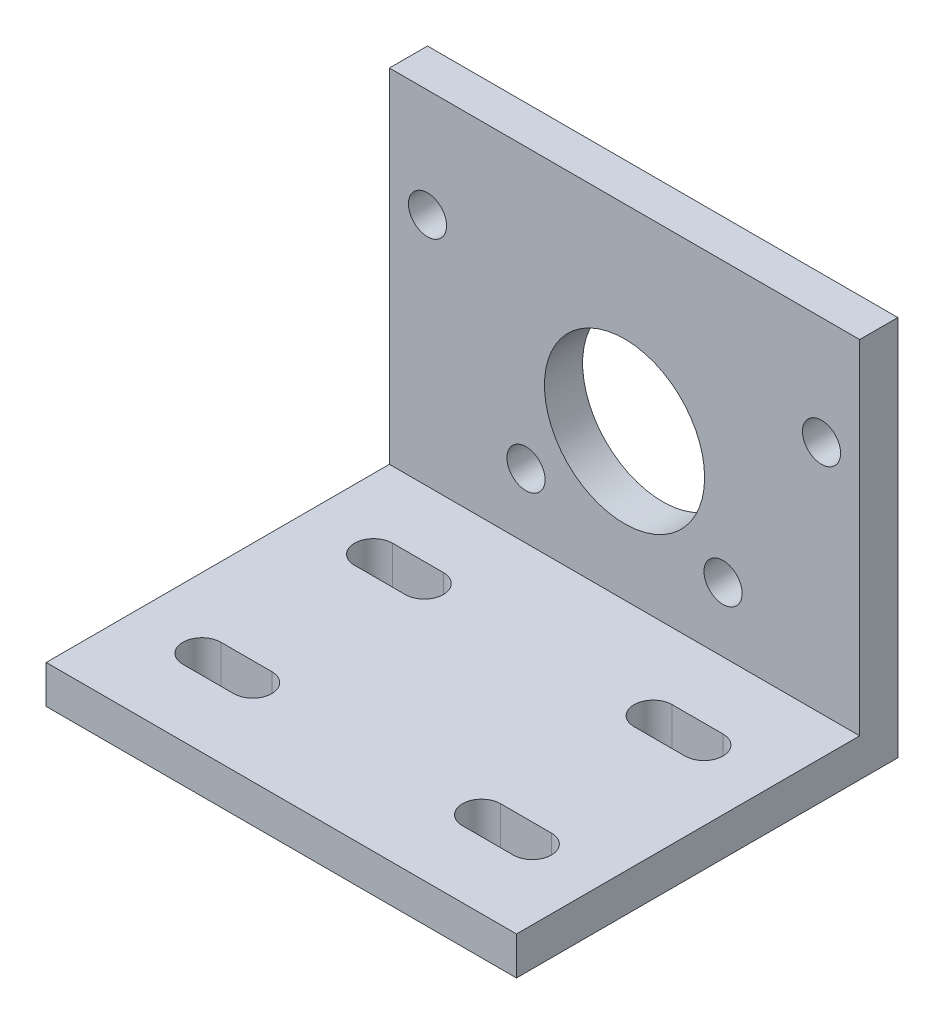
ISO-10303-21;
HEADER;
FILE_DESCRIPTION(('STEP AP214'),'2;1');
FILE_NAME('part.step','',(''),(''),'','','');
FILE_SCHEMA(('AUTOMOTIVE_DESIGN { 1 0 10303 214 1 1 1 1 }'));
ENDSEC;
DATA;
#1=APPLICATION_CONTEXT('core data for automotive mechanical design processes');
#2=APPLICATION_PROTOCOL_DEFINITION('international standard','automotive_design',2000,#1);
#3=PRODUCT_CONTEXT('',#1,'mechanical');
#4=PRODUCT('Part','Part','',(#3));
#5=PRODUCT_RELATED_PRODUCT_CATEGORY('part','',(#4));
#6=PRODUCT_DEFINITION_FORMATION('','',#4);
#7=PRODUCT_DEFINITION_CONTEXT('part definition',#1,'design');
#8=PRODUCT_DEFINITION('design','',#6,#7);
#9=PRODUCT_DEFINITION_SHAPE('','',#8);
#10=(LENGTH_UNIT() NAMED_UNIT(*) SI_UNIT(.MILLI.,.METRE.));
#11=(NAMED_UNIT(*) PLANE_ANGLE_UNIT() SI_UNIT($,.RADIAN.));
#12=(NAMED_UNIT(*) SI_UNIT($,.STERADIAN.) SOLID_ANGLE_UNIT());
#13=UNCERTAINTY_MEASURE_WITH_UNIT(LENGTH_MEASURE(1.E-05),#10,'distance_accuracy_value','');
#14=(GEOMETRIC_REPRESENTATION_CONTEXT(3) GLOBAL_UNCERTAINTY_ASSIGNED_CONTEXT((#13)) GLOBAL_UNIT_ASSIGNED_CONTEXT((#10,
#11,#12)) REPRESENTATION_CONTEXT('',''));
#15=CARTESIAN_POINT('',(0.,0.,0.));
#16=DIRECTION('',(0.,0.,1.));
#17=DIRECTION('',(1.,0.,0.));
#18=AXIS2_PLACEMENT_3D('',#15,#16,#17);
#19=CARTESIAN_POINT('',(0.,0.,30.));
#20=DIRECTION('',(0.,0.,1.));
#21=DIRECTION('',(1.,0.,0.));
#22=AXIS2_PLACEMENT_3D('',#19,#20,#21);
#23=PLANE('',#22);
#24=DIRECTION('',(-1.,0.,0.));
#25=VECTOR('',#24,1.);
#26=CARTESIAN_POINT('',(0.,3.,30.));
#27=LINE('',#26,#25);
#28=CARTESIAN_POINT('',(37.,3.,30.));
#29=VERTEX_POINT('',#28);
#30=CARTESIAN_POINT('',(0.,3.,30.));
#31=VERTEX_POINT('',#30);
#32=EDGE_CURVE('E326',#29,#31,#27,.T.);
#33=ORIENTED_EDGE('',*,*,#32,.T.);
#34=DIRECTION('',(0.,-1.,0.));
#35=VECTOR('',#34,1.);
#36=CARTESIAN_POINT('',(0.,3.,30.));
#37=LINE('',#36,#35);
#38=CARTESIAN_POINT('',(0.,0.,30.));
#39=VERTEX_POINT('',#38);
#40=EDGE_CURVE('E306',#31,#39,#37,.T.);
#41=ORIENTED_EDGE('',*,*,#40,.T.);
#42=DIRECTION('',(1.,0.,0.));
#43=VECTOR('',#42,1.);
#44=CARTESIAN_POINT('',(0.,0.,30.));
#45=LINE('',#44,#43);
#46=CARTESIAN_POINT('',(37.,0.,30.));
#47=VERTEX_POINT('',#46);
#48=EDGE_CURVE('E318',#39,#47,#45,.T.);
#49=ORIENTED_EDGE('',*,*,#48,.T.);
#50=DIRECTION('',(0.,1.,0.));
#51=VECTOR('',#50,1.);
#52=CARTESIAN_POINT('',(37.,3.,30.));
#53=LINE('',#52,#51);
#54=EDGE_CURVE('E322',#47,#29,#53,.T.);
#55=ORIENTED_EDGE('',*,*,#54,.T.);
#56=EDGE_LOOP('',(#33,#41,#49,#55));
#57=FACE_BOUND('',#56,.T.);
#58=ADVANCED_FACE('F40',(#57),#23,.T.);
#59=CARTESIAN_POINT('',(0.,0.,3.));
#60=DIRECTION('',(0.,0.,1.));
#61=DIRECTION('',(1.,0.,0.));
#62=AXIS2_PLACEMENT_3D('',#59,#60,#61);
#63=PLANE('',#62);
#64=CARTESIAN_POINT('',(18.5,14.5,3.));
#65=DIRECTION('',(0.,0.,1.));
#66=DIRECTION('',(1.,0.,0.));
#67=AXIS2_PLACEMENT_3D('',#64,#65,#66);
#68=CIRCLE('',#67,6.29999999999999);
#69=CARTESIAN_POINT('',(24.8,14.5,3.));
#70=VERTEX_POINT('',#69);
#71=EDGE_CURVE('E360',#70,#70,#68,.T.);
#72=ORIENTED_EDGE('',*,*,#71,.F.);
#73=EDGE_LOOP('',(#72));
#74=FACE_BOUND('',#73,.T.);
#75=DIRECTION('',(1.,0.,0.));
#76=VECTOR('',#75,1.);
#77=CARTESIAN_POINT('',(0.,3.,3.));
#78=LINE('',#77,#76);
#79=CARTESIAN_POINT('',(0.,3.,3.));
#80=VERTEX_POINT('',#79);
#81=CARTESIAN_POINT('',(37.,3.,3.));
#82=VERTEX_POINT('',#81);
#83=EDGE_CURVE('E368',#80,#82,#78,.T.);
#84=ORIENTED_EDGE('',*,*,#83,.T.);
#85=DIRECTION('',(0.,1.,0.));
#86=VECTOR('',#85,1.);
#87=CARTESIAN_POINT('',(37.,0.,3.));
#88=LINE('',#87,#86);
#89=CARTESIAN_POINT('',(37.,30.,3.));
#90=VERTEX_POINT('',#89);
#91=EDGE_CURVE('E371',#82,#90,#88,.T.);
#92=ORIENTED_EDGE('',*,*,#91,.T.);
#93=DIRECTION('',(1.,0.,0.));
#94=VECTOR('',#93,1.);
#95=CARTESIAN_POINT('',(0.,30.,3.));
#96=LINE('',#95,#94);
#97=CARTESIAN_POINT('',(0.,30.,3.));
#98=VERTEX_POINT('',#97);
#99=EDGE_CURVE('E374',#98,#90,#96,.T.);
#100=ORIENTED_EDGE('',*,*,#99,.F.);
#101=DIRECTION('',(0.,1.,0.));
#102=VECTOR('',#101,1.);
#103=CARTESIAN_POINT('',(0.,0.,3.));
#104=LINE('',#103,#102);
#105=EDGE_CURVE('E364',#80,#98,#104,.T.);
#106=ORIENTED_EDGE('',*,*,#105,.F.);
#107=EDGE_LOOP('',(#84,#92,#100,#106));
#108=FACE_BOUND('',#107,.T.);
#109=CARTESIAN_POINT('',(10.75,8.0766062413411,3.));
#110=DIRECTION('',(0.,0.,1.));
#111=DIRECTION('',(1.,0.,0.));
#112=AXIS2_PLACEMENT_3D('',#109,#110,#111);
#113=CIRCLE('',#112,1.5);
#114=CARTESIAN_POINT('',(12.25,8.0766062413411,3.));
#115=VERTEX_POINT('',#114);
#116=EDGE_CURVE('E356',#115,#115,#113,.T.);
#117=ORIENTED_EDGE('',*,*,#116,.F.);
#118=EDGE_LOOP('',(#117));
#119=FACE_BOUND('',#118,.T.);
#120=CARTESIAN_POINT('',(3.,21.5,3.));
#121=DIRECTION('',(0.,0.,1.));
#122=DIRECTION('',(1.,0.,0.));
#123=AXIS2_PLACEMENT_3D('',#120,#121,#122);
#124=CIRCLE('',#123,1.5);
#125=CARTESIAN_POINT('',(4.5,21.5,3.));
#126=VERTEX_POINT('',#125);
#127=EDGE_CURVE('E351',#126,#126,#124,.T.);
#128=ORIENTED_EDGE('',*,*,#127,.F.);
#129=EDGE_LOOP('',(#128));
#130=FACE_BOUND('',#129,.T.);
#131=CARTESIAN_POINT('',(34.,21.5,3.));
#132=DIRECTION('',(0.,0.,1.));
#133=DIRECTION('',(1.,0.,0.));
#134=AXIS2_PLACEMENT_3D('',#131,#132,#133);
#135=CIRCLE('',#134,1.5);
#136=CARTESIAN_POINT('',(35.5,21.5,3.));
#137=VERTEX_POINT('',#136);
#138=EDGE_CURVE('E347',#137,#137,#135,.T.);
#139=ORIENTED_EDGE('',*,*,#138,.F.);
#140=EDGE_LOOP('',(#139));
#141=FACE_BOUND('',#140,.T.);
#142=CARTESIAN_POINT('',(26.25,8.0766062413411,3.));
#143=DIRECTION('',(0.,0.,1.));
#144=DIRECTION('',(1.,0.,0.));
#145=AXIS2_PLACEMENT_3D('',#142,#143,#144);
#146=CIRCLE('',#145,1.5);
#147=CARTESIAN_POINT('',(27.75,8.0766062413411,3.));
#148=VERTEX_POINT('',#147);
#149=EDGE_CURVE('E448',#148,#148,#146,.T.);
#150=ORIENTED_EDGE('',*,*,#149,.F.);
#151=EDGE_LOOP('',(#150));
#152=FACE_BOUND('',#151,.T.);
#153=ADVANCED_FACE('F435',(#74,#108,#119,#130,#141,#152),#63,.T.);
#154=CARTESIAN_POINT('',(0.,3.,0.));
#155=DIRECTION('',(0.,1.,0.));
#156=DIRECTION('',(0.,0.,1.));
#157=AXIS2_PLACEMENT_3D('',#154,#155,#156);
#158=PLANE('',#157);
#159=CARTESIAN_POINT('',(31.5,3.,23.25));
#160=DIRECTION('',(0.,1.,0.));
#161=DIRECTION('',(0.,0.,1.));
#162=AXIS2_PLACEMENT_3D('',#159,#160,#161);
#163=CIRCLE('',#162,1.5);
#164=CARTESIAN_POINT('',(31.5,3.,24.75));
#165=VERTEX_POINT('',#164);
#166=CARTESIAN_POINT('',(31.5,3.,21.75));
#167=VERTEX_POINT('',#166);
#168=EDGE_CURVE('E478',#165,#167,#163,.T.);
#169=ORIENTED_EDGE('',*,*,#168,.F.);
#170=DIRECTION('',(1.,0.,0.));
#171=VECTOR('',#170,1.);
#172=CARTESIAN_POINT('',(27.5,3.,24.75));
#173=LINE('',#172,#171);
#174=CARTESIAN_POINT('',(27.5,3.,24.75));
#175=VERTEX_POINT('',#174);
#176=EDGE_CURVE('E455',#175,#165,#173,.T.);
#177=ORIENTED_EDGE('',*,*,#176,.F.);
#178=CARTESIAN_POINT('',(27.5,3.,23.25));
#179=DIRECTION('',(0.,1.,0.));
#180=DIRECTION('',(0.,0.,1.));
#181=AXIS2_PLACEMENT_3D('',#178,#179,#180);
#182=CIRCLE('',#181,1.5);
#183=CARTESIAN_POINT('',(27.5,3.,21.75));
#184=VERTEX_POINT('',#183);
#185=EDGE_CURVE('E451',#184,#175,#182,.T.);
#186=ORIENTED_EDGE('',*,*,#185,.F.);
#187=DIRECTION('',(-1.,0.,0.));
#188=VECTOR('',#187,1.);
#189=CARTESIAN_POINT('',(27.5,3.,21.75));
#190=LINE('',#189,#188);
#191=EDGE_CURVE('E463',#167,#184,#190,.T.);
#192=ORIENTED_EDGE('',*,*,#191,.F.);
#193=EDGE_LOOP('',(#169,#177,#186,#192));
#194=FACE_BOUND('',#193,.T.);
#195=CARTESIAN_POINT('',(31.5,3.,9.75));
#196=DIRECTION('',(0.,1.,0.));
#197=DIRECTION('',(0.,0.,1.));
#198=AXIS2_PLACEMENT_3D('',#195,#196,#197);
#199=CIRCLE('',#198,1.5);
#200=CARTESIAN_POINT('',(31.5,3.,11.25));
#201=VERTEX_POINT('',#200);
#202=CARTESIAN_POINT('',(31.5,3.,8.25));
#203=VERTEX_POINT('',#202);
#204=EDGE_CURVE('E197',#201,#203,#199,.T.);
#205=ORIENTED_EDGE('',*,*,#204,.F.);
#206=DIRECTION('',(1.,0.,0.));
#207=VECTOR('',#206,1.);
#208=CARTESIAN_POINT('',(27.5,3.,11.25));
#209=LINE('',#208,#207);
#210=CARTESIAN_POINT('',(27.5,3.,11.25));
#211=VERTEX_POINT('',#210);
#212=EDGE_CURVE('E189',#211,#201,#209,.T.);
#213=ORIENTED_EDGE('',*,*,#212,.F.);
#214=CARTESIAN_POINT('',(27.5,3.,9.75));
#215=DIRECTION('',(0.,1.,0.));
#216=DIRECTION('',(0.,0.,1.));
#217=AXIS2_PLACEMENT_3D('',#214,#215,#216);
#218=CIRCLE('',#217,1.5);
#219=CARTESIAN_POINT('',(27.5,3.,8.25));
#220=VERTEX_POINT('',#219);
#221=EDGE_CURVE('E194',#220,#211,#218,.T.);
#222=ORIENTED_EDGE('',*,*,#221,.F.);
#223=DIRECTION('',(-1.,0.,0.));
#224=VECTOR('',#223,1.);
#225=CARTESIAN_POINT('',(27.5,3.,8.25));
#226=LINE('',#225,#224);
#227=EDGE_CURVE('E500',#203,#220,#226,.T.);
#228=ORIENTED_EDGE('',*,*,#227,.F.);
#229=EDGE_LOOP('',(#205,#213,#222,#228));
#230=FACE_BOUND('',#229,.T.);
#231=DIRECTION('',(0.,0.,1.));
#232=VECTOR('',#231,1.);
#233=CARTESIAN_POINT('',(37.,3.,0.));
#234=LINE('',#233,#232);
#235=EDGE_CURVE('E339',#82,#29,#234,.T.);
#236=ORIENTED_EDGE('',*,*,#235,.F.);
#237=ORIENTED_EDGE('',*,*,#83,.F.);
#238=DIRECTION('',(0.,0.,1.));
#239=VECTOR('',#238,1.);
#240=CARTESIAN_POINT('',(0.,3.,0.));
#241=LINE('',#240,#239);
#242=EDGE_CURVE('E334',#80,#31,#241,.T.);
#243=ORIENTED_EDGE('',*,*,#242,.T.);
#244=ORIENTED_EDGE('',*,*,#32,.F.);
#245=EDGE_LOOP('',(#236,#237,#243,#244));
#246=FACE_BOUND('',#245,.T.);
#247=CARTESIAN_POINT('',(5.5,3.,9.75));
#248=DIRECTION('',(0.,1.,0.));
#249=DIRECTION('',(0.,0.,1.));
#250=AXIS2_PLACEMENT_3D('',#247,#248,#249);
#251=CIRCLE('',#250,1.5);
#252=CARTESIAN_POINT('',(5.5,3.,8.25));
#253=VERTEX_POINT('',#252);
#254=CARTESIAN_POINT('',(5.5,3.,11.25));
#255=VERTEX_POINT('',#254);
#256=EDGE_CURVE('E64',#253,#255,#251,.T.);
#257=ORIENTED_EDGE('',*,*,#256,.F.);
#258=DIRECTION('',(-1.,0.,0.));
#259=VECTOR('',#258,1.);
#260=CARTESIAN_POINT('',(5.5,3.,8.25));
#261=LINE('',#260,#259);
#262=CARTESIAN_POINT('',(9.5,3.,8.25));
#263=VERTEX_POINT('',#262);
#264=EDGE_CURVE('E277',#263,#253,#261,.T.);
#265=ORIENTED_EDGE('',*,*,#264,.F.);
#266=CARTESIAN_POINT('',(9.5,3.,9.75));
#267=DIRECTION('',(0.,1.,0.));
#268=DIRECTION('',(0.,0.,1.));
#269=AXIS2_PLACEMENT_3D('',#266,#267,#268);
#270=CIRCLE('',#269,1.5);
#271=CARTESIAN_POINT('',(9.5,3.,11.25));
#272=VERTEX_POINT('',#271);
#273=EDGE_CURVE('E296',#272,#263,#270,.T.);
#274=ORIENTED_EDGE('',*,*,#273,.F.);
#275=DIRECTION('',(1.,0.,0.));
#276=VECTOR('',#275,1.);
#277=CARTESIAN_POINT('',(5.5,3.,11.25));
#278=LINE('',#277,#276);
#279=EDGE_CURVE('E292',#255,#272,#278,.T.);
#280=ORIENTED_EDGE('',*,*,#279,.F.);
#281=EDGE_LOOP('',(#257,#265,#274,#280));
#282=FACE_BOUND('',#281,.T.);
#283=CARTESIAN_POINT('',(5.5,3.,23.25));
#284=DIRECTION('',(0.,1.,0.));
#285=DIRECTION('',(0.,0.,1.));
#286=AXIS2_PLACEMENT_3D('',#283,#284,#285);
#287=CIRCLE('',#286,1.5);
#288=CARTESIAN_POINT('',(5.5,3.,21.75));
#289=VERTEX_POINT('',#288);
#290=CARTESIAN_POINT('',(5.5,3.,24.75));
#291=VERTEX_POINT('',#290);
#292=EDGE_CURVE('E56',#289,#291,#287,.T.);
#293=ORIENTED_EDGE('',*,*,#292,.F.);
#294=DIRECTION('',(-1.,0.,0.));
#295=VECTOR('',#294,1.);
#296=CARTESIAN_POINT('',(5.5,3.,21.75));
#297=LINE('',#296,#295);
#298=CARTESIAN_POINT('',(9.5,3.,21.75));
#299=VERTEX_POINT('',#298);
#300=EDGE_CURVE('E235',#299,#289,#297,.T.);
#301=ORIENTED_EDGE('',*,*,#300,.F.);
#302=CARTESIAN_POINT('',(9.5,3.,23.25));
#303=DIRECTION('',(0.,1.,0.));
#304=DIRECTION('',(0.,0.,1.));
#305=AXIS2_PLACEMENT_3D('',#302,#303,#304);
#306=CIRCLE('',#305,1.5);
#307=CARTESIAN_POINT('',(9.5,3.,24.75));
#308=VERTEX_POINT('',#307);
#309=EDGE_CURVE('E255',#308,#299,#306,.T.);
#310=ORIENTED_EDGE('',*,*,#309,.F.);
#311=DIRECTION('',(1.,0.,0.));
#312=VECTOR('',#311,1.);
#313=CARTESIAN_POINT('',(5.5,3.,24.75));
#314=LINE('',#313,#312);
#315=EDGE_CURVE('E250',#291,#308,#314,.T.);
#316=ORIENTED_EDGE('',*,*,#315,.F.);
#317=EDGE_LOOP('',(#293,#301,#310,#316));
#318=FACE_BOUND('',#317,.T.);
#319=ADVANCED_FACE('F191',(#194,#230,#246,#282,#318),#158,.T.);
#320=CARTESIAN_POINT('',(0.,0.,3.));
#321=DIRECTION('',(-1.,0.,0.));
#322=DIRECTION('',(0.,0.,1.));
#323=AXIS2_PLACEMENT_3D('',#320,#321,#322);
#324=PLANE('',#323);
#325=DIRECTION('',(0.,1.,0.));
#326=VECTOR('',#325,1.);
#327=CARTESIAN_POINT('',(0.,0.,0.));
#328=LINE('',#327,#326);
#329=CARTESIAN_POINT('',(0.,0.,0.));
#330=VERTEX_POINT('',#329);
#331=CARTESIAN_POINT('',(0.,30.,0.));
#332=VERTEX_POINT('',#331);
#333=EDGE_CURVE('E397',#330,#332,#328,.T.);
#334=ORIENTED_EDGE('',*,*,#333,.F.);
#335=DIRECTION('',(0.,0.,1.));
#336=VECTOR('',#335,1.);
#337=CARTESIAN_POINT('',(0.,0.,0.));
#338=LINE('',#337,#336);
#339=EDGE_CURVE('E333',#330,#39,#338,.T.);
#340=ORIENTED_EDGE('',*,*,#339,.T.);
#341=ORIENTED_EDGE('',*,*,#40,.F.);
#342=ORIENTED_EDGE('',*,*,#242,.F.);
#343=ORIENTED_EDGE('',*,*,#105,.T.);
#344=DIRECTION('',(0.,0.,-1.));
#345=VECTOR('',#344,1.);
#346=CARTESIAN_POINT('',(0.,30.,3.));
#347=LINE('',#346,#345);
#348=EDGE_CURVE('E49',#98,#332,#347,.T.);
#349=ORIENTED_EDGE('',*,*,#348,.T.);
#350=EDGE_LOOP('',(#334,#340,#341,#342,#343,#349));
#351=FACE_BOUND('',#350,.T.);
#352=ADVANCED_FACE('F409',(#351),#324,.T.);
#353=CARTESIAN_POINT('',(37.,0.,3.));
#354=DIRECTION('',(-1.,0.,0.));
#355=DIRECTION('',(0.,-1.,0.));
#356=AXIS2_PLACEMENT_3D('',#353,#354,#355);
#357=PLANE('',#356);
#358=DIRECTION('',(0.,1.,0.));
#359=VECTOR('',#358,1.);
#360=CARTESIAN_POINT('',(37.,0.,0.));
#361=LINE('',#360,#359);
#362=CARTESIAN_POINT('',(37.,0.,0.));
#363=VERTEX_POINT('',#362);
#364=CARTESIAN_POINT('',(37.,30.,0.));
#365=VERTEX_POINT('',#364);
#366=EDGE_CURVE('E401',#363,#365,#361,.T.);
#367=ORIENTED_EDGE('',*,*,#366,.T.);
#368=DIRECTION('',(0.,0.,-1.));
#369=VECTOR('',#368,1.);
#370=CARTESIAN_POINT('',(37.,30.,3.));
#371=LINE('',#370,#369);
#372=EDGE_CURVE('E11',#90,#365,#371,.T.);
#373=ORIENTED_EDGE('',*,*,#372,.F.);
#374=ORIENTED_EDGE('',*,*,#91,.F.);
#375=ORIENTED_EDGE('',*,*,#235,.T.);
#376=ORIENTED_EDGE('',*,*,#54,.F.);
#377=DIRECTION('',(0.,0.,1.));
#378=VECTOR('',#377,1.);
#379=CARTESIAN_POINT('',(37.,0.,0.));
#380=LINE('',#379,#378);
#381=EDGE_CURVE('E342',#363,#47,#380,.T.);
#382=ORIENTED_EDGE('',*,*,#381,.F.);
#383=EDGE_LOOP('',(#367,#373,#374,#375,#376,#382));
#384=FACE_BOUND('',#383,.T.);
#385=ADVANCED_FACE('F424',(#384),#357,.F.);
#386=CARTESIAN_POINT('',(18.5,14.5,3.));
#387=DIRECTION('',(0.,0.,-1.));
#388=DIRECTION('',(-1.,0.,0.));
#389=AXIS2_PLACEMENT_3D('',#386,#387,#388);
#390=CYLINDRICAL_SURFACE('',#389,6.29999999999999);
#391=ORIENTED_EDGE('',*,*,#71,.T.);
#392=EDGE_LOOP('',(#391));
#393=FACE_BOUND('',#392,.T.);
#394=CARTESIAN_POINT('',(18.5,14.5,0.));
#395=DIRECTION('',(0.,0.,1.));
#396=DIRECTION('',(1.,0.,0.));
#397=AXIS2_PLACEMENT_3D('',#394,#395,#396);
#398=CIRCLE('',#397,6.29999999999999);
#399=CARTESIAN_POINT('',(24.8,14.5,0.));
#400=VERTEX_POINT('',#399);
#401=EDGE_CURVE('E393',#400,#400,#398,.T.);
#402=ORIENTED_EDGE('',*,*,#401,.F.);
#403=EDGE_LOOP('',(#402));
#404=FACE_BOUND('',#403,.T.);
#405=ADVANCED_FACE('F580',(#393,#404),#390,.F.);
#406=CARTESIAN_POINT('',(10.75,8.0766062413411,3.));
#407=DIRECTION('',(0.,0.,-1.));
#408=DIRECTION('',(-1.,0.,0.));
#409=AXIS2_PLACEMENT_3D('',#406,#407,#408);
#410=CYLINDRICAL_SURFACE('',#409,1.5);
#411=ORIENTED_EDGE('',*,*,#116,.T.);
#412=EDGE_LOOP('',(#411));
#413=FACE_BOUND('',#412,.T.);
#414=CARTESIAN_POINT('',(10.75,8.0766062413411,0.));
#415=DIRECTION('',(0.,0.,1.));
#416=DIRECTION('',(1.,0.,0.));
#417=AXIS2_PLACEMENT_3D('',#414,#415,#416);
#418=CIRCLE('',#417,1.5);
#419=CARTESIAN_POINT('',(12.25,8.0766062413411,0.));
#420=VERTEX_POINT('',#419);
#421=EDGE_CURVE('E389',#420,#420,#418,.T.);
#422=ORIENTED_EDGE('',*,*,#421,.F.);
#423=EDGE_LOOP('',(#422));
#424=FACE_BOUND('',#423,.T.);
#425=ADVANCED_FACE('F585',(#413,#424),#410,.F.);
#426=CARTESIAN_POINT('',(3.,21.5,3.));
#427=DIRECTION('',(0.,0.,-1.));
#428=DIRECTION('',(-1.,0.,0.));
#429=AXIS2_PLACEMENT_3D('',#426,#427,#428);
#430=CYLINDRICAL_SURFACE('',#429,1.5);
#431=ORIENTED_EDGE('',*,*,#127,.T.);
#432=EDGE_LOOP('',(#431));
#433=FACE_BOUND('',#432,.T.);
#434=CARTESIAN_POINT('',(3.,21.5,0.));
#435=DIRECTION('',(0.,0.,1.));
#436=DIRECTION('',(1.,0.,0.));
#437=AXIS2_PLACEMENT_3D('',#434,#435,#436);
#438=CIRCLE('',#437,1.5);
#439=CARTESIAN_POINT('',(4.5,21.5,0.));
#440=VERTEX_POINT('',#439);
#441=EDGE_CURVE('E385',#440,#440,#438,.T.);
#442=ORIENTED_EDGE('',*,*,#441,.F.);
#443=EDGE_LOOP('',(#442));
#444=FACE_BOUND('',#443,.T.);
#445=ADVANCED_FACE('F589',(#433,#444),#430,.F.);
#446=CARTESIAN_POINT('',(26.25,8.0766062413411,3.));
#447=DIRECTION('',(0.,0.,-1.));
#448=DIRECTION('',(-1.,0.,0.));
#449=AXIS2_PLACEMENT_3D('',#446,#447,#448);
#450=CYLINDRICAL_SURFACE('',#449,1.5);
#451=ORIENTED_EDGE('',*,*,#149,.T.);
#452=EDGE_LOOP('',(#451));
#453=FACE_BOUND('',#452,.T.);
#454=CARTESIAN_POINT('',(26.25,8.0766062413411,0.));
#455=DIRECTION('',(0.,0.,1.));
#456=DIRECTION('',(1.,0.,0.));
#457=AXIS2_PLACEMENT_3D('',#454,#455,#456);
#458=CIRCLE('',#457,1.5);
#459=CARTESIAN_POINT('',(27.75,8.0766062413411,0.));
#460=VERTEX_POINT('',#459);
#461=EDGE_CURVE('E381',#460,#460,#458,.T.);
#462=ORIENTED_EDGE('',*,*,#461,.F.);
#463=EDGE_LOOP('',(#462));
#464=FACE_BOUND('',#463,.T.);
#465=ADVANCED_FACE('F592',(#453,#464),#450,.F.);
#466=CARTESIAN_POINT('',(34.,21.5,3.));
#467=DIRECTION('',(0.,0.,-1.));
#468=DIRECTION('',(-1.,0.,0.));
#469=AXIS2_PLACEMENT_3D('',#466,#467,#468);
#470=CYLINDRICAL_SURFACE('',#469,1.5);
#471=ORIENTED_EDGE('',*,*,#138,.T.);
#472=EDGE_LOOP('',(#471));
#473=FACE_BOUND('',#472,.T.);
#474=CARTESIAN_POINT('',(34.,21.5,0.));
#475=DIRECTION('',(0.,0.,1.));
#476=DIRECTION('',(1.,0.,0.));
#477=AXIS2_PLACEMENT_3D('',#474,#475,#476);
#478=CIRCLE('',#477,1.5);
#479=CARTESIAN_POINT('',(35.5,21.5,0.));
#480=VERTEX_POINT('',#479);
#481=EDGE_CURVE('E338',#480,#480,#478,.T.);
#482=ORIENTED_EDGE('',*,*,#481,.F.);
#483=EDGE_LOOP('',(#482));
#484=FACE_BOUND('',#483,.T.);
#485=ADVANCED_FACE('F42',(#473,#484),#470,.F.);
#486=CARTESIAN_POINT('',(0.,30.,3.));
#487=DIRECTION('',(0.,1.,0.));
#488=DIRECTION('',(0.,0.,1.));
#489=AXIS2_PLACEMENT_3D('',#486,#487,#488);
#490=PLANE('',#489);
#491=DIRECTION('',(1.,0.,0.));
#492=VECTOR('',#491,1.);
#493=CARTESIAN_POINT('',(0.,30.,0.));
#494=LINE('',#493,#492);
#495=EDGE_CURVE('E352',#332,#365,#494,.T.);
#496=ORIENTED_EDGE('',*,*,#495,.F.);
#497=ORIENTED_EDGE('',*,*,#348,.F.);
#498=ORIENTED_EDGE('',*,*,#99,.T.);
#499=ORIENTED_EDGE('',*,*,#372,.T.);
#500=EDGE_LOOP('',(#496,#497,#498,#499));
#501=FACE_BOUND('',#500,.T.);
#502=ADVANCED_FACE('F419',(#501),#490,.T.);
#503=CARTESIAN_POINT('',(0.,0.,0.));
#504=DIRECTION('',(0.,0.,1.));
#505=DIRECTION('',(1.,0.,0.));
#506=AXIS2_PLACEMENT_3D('',#503,#504,#505);
#507=PLANE('',#506);
#508=ORIENTED_EDGE('',*,*,#481,.T.);
#509=EDGE_LOOP('',(#508));
#510=FACE_BOUND('',#509,.T.);
#511=ORIENTED_EDGE('',*,*,#461,.T.);
#512=EDGE_LOOP('',(#511));
#513=FACE_BOUND('',#512,.T.);
#514=ORIENTED_EDGE('',*,*,#441,.T.);
#515=EDGE_LOOP('',(#514));
#516=FACE_BOUND('',#515,.T.);
#517=ORIENTED_EDGE('',*,*,#421,.T.);
#518=EDGE_LOOP('',(#517));
#519=FACE_BOUND('',#518,.T.);
#520=ORIENTED_EDGE('',*,*,#401,.T.);
#521=EDGE_LOOP('',(#520));
#522=FACE_BOUND('',#521,.T.);
#523=ORIENTED_EDGE('',*,*,#333,.T.);
#524=ORIENTED_EDGE('',*,*,#495,.T.);
#525=ORIENTED_EDGE('',*,*,#366,.F.);
#526=DIRECTION('',(1.,0.,0.));
#527=VECTOR('',#526,1.);
#528=CARTESIAN_POINT('',(0.,0.,0.));
#529=LINE('',#528,#527);
#530=EDGE_CURVE('E329',#330,#363,#529,.T.);
#531=ORIENTED_EDGE('',*,*,#530,.F.);
#532=EDGE_LOOP('',(#523,#524,#525,#531));
#533=FACE_BOUND('',#532,.T.);
#534=ADVANCED_FACE('F418',(#510,#513,#516,#519,#522,#533),#507,.F.);
#535=CARTESIAN_POINT('',(0.,0.,0.));
#536=DIRECTION('',(0.,-1.,0.));
#537=DIRECTION('',(0.,0.,-1.));
#538=AXIS2_PLACEMENT_3D('',#535,#536,#537);
#539=PLANE('',#538);
#540=CARTESIAN_POINT('',(27.5,0.,9.75));
#541=DIRECTION('',(0.,1.,0.));
#542=DIRECTION('',(0.,0.,1.));
#543=AXIS2_PLACEMENT_3D('',#540,#541,#542);
#544=CIRCLE('',#543,1.5);
#545=CARTESIAN_POINT('',(27.5,0.,8.25));
#546=VERTEX_POINT('',#545);
#547=CARTESIAN_POINT('',(27.5,0.,11.25));
#548=VERTEX_POINT('',#547);
#549=EDGE_CURVE('E497',#546,#548,#544,.T.);
#550=ORIENTED_EDGE('',*,*,#549,.T.);
#551=DIRECTION('',(1.,0.,0.));
#552=VECTOR('',#551,1.);
#553=CARTESIAN_POINT('',(27.5,0.,11.25));
#554=LINE('',#553,#552);
#555=CARTESIAN_POINT('',(31.5,0.,11.25));
#556=VERTEX_POINT('',#555);
#557=EDGE_CURVE('E215',#548,#556,#554,.T.);
#558=ORIENTED_EDGE('',*,*,#557,.T.);
#559=CARTESIAN_POINT('',(31.5,0.,9.75));
#560=DIRECTION('',(0.,1.,0.));
#561=DIRECTION('',(0.,0.,1.));
#562=AXIS2_PLACEMENT_3D('',#559,#560,#561);
#563=CIRCLE('',#562,1.5);
#564=CARTESIAN_POINT('',(31.5,0.,8.25));
#565=VERTEX_POINT('',#564);
#566=EDGE_CURVE('E226',#556,#565,#563,.T.);
#567=ORIENTED_EDGE('',*,*,#566,.T.);
#568=DIRECTION('',(-1.,0.,0.));
#569=VECTOR('',#568,1.);
#570=CARTESIAN_POINT('',(27.5,0.,8.25));
#571=LINE('',#570,#569);
#572=EDGE_CURVE('E219',#565,#546,#571,.T.);
#573=ORIENTED_EDGE('',*,*,#572,.T.);
#574=EDGE_LOOP('',(#550,#558,#567,#573));
#575=FACE_BOUND('',#574,.T.);
#576=CARTESIAN_POINT('',(5.5,0.,23.25));
#577=DIRECTION('',(0.,1.,0.));
#578=DIRECTION('',(0.,0.,1.));
#579=AXIS2_PLACEMENT_3D('',#576,#577,#578);
#580=CIRCLE('',#579,1.5);
#581=CARTESIAN_POINT('',(5.5,0.,21.75));
#582=VERTEX_POINT('',#581);
#583=CARTESIAN_POINT('',(5.5,0.,24.75));
#584=VERTEX_POINT('',#583);
#585=EDGE_CURVE('E230',#582,#584,#580,.T.);
#586=ORIENTED_EDGE('',*,*,#585,.T.);
#587=DIRECTION('',(1.,0.,0.));
#588=VECTOR('',#587,1.);
#589=CARTESIAN_POINT('',(5.5,0.,24.75));
#590=LINE('',#589,#588);
#591=CARTESIAN_POINT('',(9.5,0.,24.75));
#592=VERTEX_POINT('',#591);
#593=EDGE_CURVE('E234',#584,#592,#590,.T.);
#594=ORIENTED_EDGE('',*,*,#593,.T.);
#595=CARTESIAN_POINT('',(9.5,0.,23.25));
#596=DIRECTION('',(0.,1.,0.));
#597=DIRECTION('',(0.,0.,1.));
#598=AXIS2_PLACEMENT_3D('',#595,#596,#597);
#599=CIRCLE('',#598,1.5);
#600=CARTESIAN_POINT('',(9.5,0.,21.75));
#601=VERTEX_POINT('',#600);
#602=EDGE_CURVE('E239',#592,#601,#599,.T.);
#603=ORIENTED_EDGE('',*,*,#602,.T.);
#604=DIRECTION('',(-1.,0.,0.));
#605=VECTOR('',#604,1.);
#606=CARTESIAN_POINT('',(5.5,0.,21.75));
#607=LINE('',#606,#605);
#608=EDGE_CURVE('E243',#601,#582,#607,.T.);
#609=ORIENTED_EDGE('',*,*,#608,.T.);
#610=EDGE_LOOP('',(#586,#594,#603,#609));
#611=FACE_BOUND('',#610,.T.);
#612=CARTESIAN_POINT('',(27.5,0.,23.25));
#613=DIRECTION('',(0.,1.,0.));
#614=DIRECTION('',(0.,0.,1.));
#615=AXIS2_PLACEMENT_3D('',#612,#613,#614);
#616=CIRCLE('',#615,1.5);
#617=CARTESIAN_POINT('',(27.5,0.,21.75));
#618=VERTEX_POINT('',#617);
#619=CARTESIAN_POINT('',(27.5,0.,24.75));
#620=VERTEX_POINT('',#619);
#621=EDGE_CURVE('E458',#618,#620,#616,.T.);
#622=ORIENTED_EDGE('',*,*,#621,.T.);
#623=DIRECTION('',(1.,0.,0.));
#624=VECTOR('',#623,1.);
#625=CARTESIAN_POINT('',(27.5,0.,24.75));
#626=LINE('',#625,#624);
#627=CARTESIAN_POINT('',(31.5,0.,24.75));
#628=VERTEX_POINT('',#627);
#629=EDGE_CURVE('E462',#620,#628,#626,.T.);
#630=ORIENTED_EDGE('',*,*,#629,.T.);
#631=CARTESIAN_POINT('',(31.5,0.,23.25));
#632=DIRECTION('',(0.,1.,0.));
#633=DIRECTION('',(0.,0.,1.));
#634=AXIS2_PLACEMENT_3D('',#631,#632,#633);
#635=CIRCLE('',#634,1.5);
#636=CARTESIAN_POINT('',(31.5,0.,21.75));
#637=VERTEX_POINT('',#636);
#638=EDGE_CURVE('E467',#628,#637,#635,.T.);
#639=ORIENTED_EDGE('',*,*,#638,.T.);
#640=DIRECTION('',(-1.,0.,0.));
#641=VECTOR('',#640,1.);
#642=CARTESIAN_POINT('',(27.5,0.,21.75));
#643=LINE('',#642,#641);
#644=EDGE_CURVE('E471',#637,#618,#643,.T.);
#645=ORIENTED_EDGE('',*,*,#644,.T.);
#646=EDGE_LOOP('',(#622,#630,#639,#645));
#647=FACE_BOUND('',#646,.T.);
#648=CARTESIAN_POINT('',(5.5,0.,9.75));
#649=DIRECTION('',(0.,1.,0.));
#650=DIRECTION('',(0.,0.,1.));
#651=AXIS2_PLACEMENT_3D('',#648,#649,#650);
#652=CIRCLE('',#651,1.5);
#653=CARTESIAN_POINT('',(5.5,0.,8.25));
#654=VERTEX_POINT('',#653);
#655=CARTESIAN_POINT('',(5.5,0.,11.25));
#656=VERTEX_POINT('',#655);
#657=EDGE_CURVE('E272',#654,#656,#652,.T.);
#658=ORIENTED_EDGE('',*,*,#657,.T.);
#659=DIRECTION('',(1.,0.,0.));
#660=VECTOR('',#659,1.);
#661=CARTESIAN_POINT('',(5.5,0.,11.25));
#662=LINE('',#661,#660);
#663=CARTESIAN_POINT('',(9.5,0.,11.25));
#664=VERTEX_POINT('',#663);
#665=EDGE_CURVE('E276',#656,#664,#662,.T.);
#666=ORIENTED_EDGE('',*,*,#665,.T.);
#667=CARTESIAN_POINT('',(9.5,0.,9.75));
#668=DIRECTION('',(0.,1.,0.));
#669=DIRECTION('',(0.,0.,1.));
#670=AXIS2_PLACEMENT_3D('',#667,#668,#669);
#671=CIRCLE('',#670,1.5);
#672=CARTESIAN_POINT('',(9.5,0.,8.25));
#673=VERTEX_POINT('',#672);
#674=EDGE_CURVE('E281',#664,#673,#671,.T.);
#675=ORIENTED_EDGE('',*,*,#674,.T.);
#676=DIRECTION('',(-1.,0.,0.));
#677=VECTOR('',#676,1.);
#678=CARTESIAN_POINT('',(5.5,0.,8.25));
#679=LINE('',#678,#677);
#680=EDGE_CURVE('E285',#673,#654,#679,.T.);
#681=ORIENTED_EDGE('',*,*,#680,.T.);
#682=EDGE_LOOP('',(#658,#666,#675,#681));
#683=FACE_BOUND('',#682,.T.);
#684=ORIENTED_EDGE('',*,*,#381,.T.);
#685=ORIENTED_EDGE('',*,*,#48,.F.);
#686=ORIENTED_EDGE('',*,*,#339,.F.);
#687=ORIENTED_EDGE('',*,*,#530,.T.);
#688=EDGE_LOOP('',(#684,#685,#686,#687));
#689=FACE_BOUND('',#688,.T.);
#690=ADVANCED_FACE('F428',(#575,#611,#647,#683,#689),#539,.T.);
#691=CARTESIAN_POINT('',(5.5,0.,9.75));
#692=DIRECTION('',(0.,1.,0.));
#693=DIRECTION('',(0.,0.,1.));
#694=AXIS2_PLACEMENT_3D('',#691,#692,#693);
#695=CYLINDRICAL_SURFACE('',#694,1.5);
#696=ORIENTED_EDGE('',*,*,#256,.T.);
#697=DIRECTION('',(0.,1.,0.));
#698=VECTOR('',#697,1.);
#699=CARTESIAN_POINT('',(5.5,0.,11.25));
#700=LINE('',#699,#698);
#701=EDGE_CURVE('E289',#656,#255,#700,.T.);
#702=ORIENTED_EDGE('',*,*,#701,.F.);
#703=ORIENTED_EDGE('',*,*,#657,.F.);
#704=DIRECTION('',(0.,1.,0.));
#705=VECTOR('',#704,1.);
#706=CARTESIAN_POINT('',(5.5,0.,8.25));
#707=LINE('',#706,#705);
#708=EDGE_CURVE('E303',#654,#253,#707,.T.);
#709=ORIENTED_EDGE('',*,*,#708,.T.);
#710=EDGE_LOOP('',(#696,#702,#703,#709));
#711=FACE_BOUND('',#710,.T.);
#712=ADVANCED_FACE('F520',(#711),#695,.F.);
#713=CARTESIAN_POINT('',(5.5,0.,8.25));
#714=DIRECTION('',(0.,0.,-1.));
#715=DIRECTION('',(-1.,0.,0.));
#716=AXIS2_PLACEMENT_3D('',#713,#714,#715);
#717=PLANE('',#716);
#718=ORIENTED_EDGE('',*,*,#264,.T.);
#719=ORIENTED_EDGE('',*,*,#708,.F.);
#720=ORIENTED_EDGE('',*,*,#680,.F.);
#721=DIRECTION('',(0.,1.,0.));
#722=VECTOR('',#721,1.);
#723=CARTESIAN_POINT('',(9.5,0.,8.25));
#724=LINE('',#723,#722);
#725=EDGE_CURVE('E307',#673,#263,#724,.T.);
#726=ORIENTED_EDGE('',*,*,#725,.T.);
#727=EDGE_LOOP('',(#718,#719,#720,#726));
#728=FACE_BOUND('',#727,.T.);
#729=ADVANCED_FACE('F538',(#728),#717,.F.);
#730=CARTESIAN_POINT('',(9.5,0.,9.75));
#731=DIRECTION('',(0.,1.,0.));
#732=DIRECTION('',(0.,0.,1.));
#733=AXIS2_PLACEMENT_3D('',#730,#731,#732);
#734=CYLINDRICAL_SURFACE('',#733,1.5);
#735=ORIENTED_EDGE('',*,*,#273,.T.);
#736=ORIENTED_EDGE('',*,*,#725,.F.);
#737=ORIENTED_EDGE('',*,*,#674,.F.);
#738=DIRECTION('',(0.,1.,0.));
#739=VECTOR('',#738,1.);
#740=CARTESIAN_POINT('',(9.5,0.,11.25));
#741=LINE('',#740,#739);
#742=EDGE_CURVE('E310',#664,#272,#741,.T.);
#743=ORIENTED_EDGE('',*,*,#742,.T.);
#744=EDGE_LOOP('',(#735,#736,#737,#743));
#745=FACE_BOUND('',#744,.T.);
#746=ADVANCED_FACE('F535',(#745),#734,.F.);
#747=CARTESIAN_POINT('',(5.5,0.,11.25));
#748=DIRECTION('',(0.,0.,1.));
#749=DIRECTION('',(1.,0.,0.));
#750=AXIS2_PLACEMENT_3D('',#747,#748,#749);
#751=PLANE('',#750);
#752=ORIENTED_EDGE('',*,*,#279,.T.);
#753=ORIENTED_EDGE('',*,*,#742,.F.);
#754=ORIENTED_EDGE('',*,*,#665,.F.);
#755=ORIENTED_EDGE('',*,*,#701,.T.);
#756=EDGE_LOOP('',(#752,#753,#754,#755));
#757=FACE_BOUND('',#756,.T.);
#758=ADVANCED_FACE('F532',(#757),#751,.F.);
#759=CARTESIAN_POINT('',(27.5,0.,23.25));
#760=DIRECTION('',(0.,1.,0.));
#761=DIRECTION('',(0.,0.,1.));
#762=AXIS2_PLACEMENT_3D('',#759,#760,#761);
#763=CYLINDRICAL_SURFACE('',#762,1.5);
#764=ORIENTED_EDGE('',*,*,#185,.T.);
#765=DIRECTION('',(0.,1.,0.));
#766=VECTOR('',#765,1.);
#767=CARTESIAN_POINT('',(27.5,0.,24.75));
#768=LINE('',#767,#766);
#769=EDGE_CURVE('E474',#620,#175,#768,.T.);
#770=ORIENTED_EDGE('',*,*,#769,.F.);
#771=ORIENTED_EDGE('',*,*,#621,.F.);
#772=DIRECTION('',(0.,1.,0.));
#773=VECTOR('',#772,1.);
#774=CARTESIAN_POINT('',(27.5,0.,21.75));
#775=LINE('',#774,#773);
#776=EDGE_CURVE('E251',#618,#184,#775,.T.);
#777=ORIENTED_EDGE('',*,*,#776,.T.);
#778=EDGE_LOOP('',(#764,#770,#771,#777));
#779=FACE_BOUND('',#778,.T.);
#780=ADVANCED_FACE('F652',(#779),#763,.F.);
#781=CARTESIAN_POINT('',(27.5,0.,21.75));
#782=DIRECTION('',(0.,0.,-1.));
#783=DIRECTION('',(-1.,0.,0.));
#784=AXIS2_PLACEMENT_3D('',#781,#782,#783);
#785=PLANE('',#784);
#786=ORIENTED_EDGE('',*,*,#191,.T.);
#787=ORIENTED_EDGE('',*,*,#776,.F.);
#788=ORIENTED_EDGE('',*,*,#644,.F.);
#789=DIRECTION('',(0.,1.,0.));
#790=VECTOR('',#789,1.);
#791=CARTESIAN_POINT('',(31.5,0.,21.75));
#792=LINE('',#791,#790);
#793=EDGE_CURVE('E487',#637,#167,#792,.T.);
#794=ORIENTED_EDGE('',*,*,#793,.T.);
#795=EDGE_LOOP('',(#786,#787,#788,#794));
#796=FACE_BOUND('',#795,.T.);
#797=ADVANCED_FACE('F660',(#796),#785,.F.);
#798=CARTESIAN_POINT('',(31.5,0.,23.25));
#799=DIRECTION('',(0.,1.,0.));
#800=DIRECTION('',(0.,0.,1.));
#801=AXIS2_PLACEMENT_3D('',#798,#799,#800);
#802=CYLINDRICAL_SURFACE('',#801,1.5);
#803=ORIENTED_EDGE('',*,*,#168,.T.);
#804=ORIENTED_EDGE('',*,*,#793,.F.);
#805=ORIENTED_EDGE('',*,*,#638,.F.);
#806=DIRECTION('',(0.,1.,0.));
#807=VECTOR('',#806,1.);
#808=CARTESIAN_POINT('',(31.5,0.,24.75));
#809=LINE('',#808,#807);
#810=EDGE_CURVE('E490',#628,#165,#809,.T.);
#811=ORIENTED_EDGE('',*,*,#810,.T.);
#812=EDGE_LOOP('',(#803,#804,#805,#811));
#813=FACE_BOUND('',#812,.T.);
#814=ADVANCED_FACE('F670',(#813),#802,.F.);
#815=CARTESIAN_POINT('',(27.5,0.,24.75));
#816=DIRECTION('',(0.,0.,1.));
#817=DIRECTION('',(1.,0.,0.));
#818=AXIS2_PLACEMENT_3D('',#815,#816,#817);
#819=PLANE('',#818);
#820=ORIENTED_EDGE('',*,*,#176,.T.);
#821=ORIENTED_EDGE('',*,*,#810,.F.);
#822=ORIENTED_EDGE('',*,*,#629,.F.);
#823=ORIENTED_EDGE('',*,*,#769,.T.);
#824=EDGE_LOOP('',(#820,#821,#822,#823));
#825=FACE_BOUND('',#824,.T.);
#826=ADVANCED_FACE('F680',(#825),#819,.F.);
#827=CARTESIAN_POINT('',(5.5,0.,23.25));
#828=DIRECTION('',(0.,1.,0.));
#829=DIRECTION('',(0.,0.,1.));
#830=AXIS2_PLACEMENT_3D('',#827,#828,#829);
#831=CYLINDRICAL_SURFACE('',#830,1.5);
#832=ORIENTED_EDGE('',*,*,#292,.T.);
#833=DIRECTION('',(0.,1.,0.));
#834=VECTOR('',#833,1.);
#835=CARTESIAN_POINT('',(5.5,0.,24.75));
#836=LINE('',#835,#834);
#837=EDGE_CURVE('E247',#584,#291,#836,.T.);
#838=ORIENTED_EDGE('',*,*,#837,.F.);
#839=ORIENTED_EDGE('',*,*,#585,.F.);
#840=DIRECTION('',(0.,1.,0.));
#841=VECTOR('',#840,1.);
#842=CARTESIAN_POINT('',(5.5,0.,21.75));
#843=LINE('',#842,#841);
#844=EDGE_CURVE('E211',#582,#289,#843,.T.);
#845=ORIENTED_EDGE('',*,*,#844,.T.);
#846=EDGE_LOOP('',(#832,#838,#839,#845));
#847=FACE_BOUND('',#846,.T.);
#848=ADVANCED_FACE('F550',(#847),#831,.F.);
#849=CARTESIAN_POINT('',(5.5,0.,21.75));
#850=DIRECTION('',(0.,0.,-1.));
#851=DIRECTION('',(-1.,0.,0.));
#852=AXIS2_PLACEMENT_3D('',#849,#850,#851);
#853=PLANE('',#852);
#854=ORIENTED_EDGE('',*,*,#300,.T.);
#855=ORIENTED_EDGE('',*,*,#844,.F.);
#856=ORIENTED_EDGE('',*,*,#608,.F.);
#857=DIRECTION('',(0.,1.,0.));
#858=VECTOR('',#857,1.);
#859=CARTESIAN_POINT('',(9.5,0.,21.75));
#860=LINE('',#859,#858);
#861=EDGE_CURVE('E264',#601,#299,#860,.T.);
#862=ORIENTED_EDGE('',*,*,#861,.T.);
#863=EDGE_LOOP('',(#854,#855,#856,#862));
#864=FACE_BOUND('',#863,.T.);
#865=ADVANCED_FACE('F553',(#864),#853,.F.);
#866=CARTESIAN_POINT('',(9.5,0.,23.25));
#867=DIRECTION('',(0.,1.,0.));
#868=DIRECTION('',(0.,0.,1.));
#869=AXIS2_PLACEMENT_3D('',#866,#867,#868);
#870=CYLINDRICAL_SURFACE('',#869,1.5);
#871=ORIENTED_EDGE('',*,*,#309,.T.);
#872=ORIENTED_EDGE('',*,*,#861,.F.);
#873=ORIENTED_EDGE('',*,*,#602,.F.);
#874=DIRECTION('',(0.,1.,0.));
#875=VECTOR('',#874,1.);
#876=CARTESIAN_POINT('',(9.5,0.,24.75));
#877=LINE('',#876,#875);
#878=EDGE_CURVE('E267',#592,#308,#877,.T.);
#879=ORIENTED_EDGE('',*,*,#878,.T.);
#880=EDGE_LOOP('',(#871,#872,#873,#879));
#881=FACE_BOUND('',#880,.T.);
#882=ADVANCED_FACE('F555',(#881),#870,.F.);
#883=CARTESIAN_POINT('',(5.5,0.,24.75));
#884=DIRECTION('',(0.,0.,1.));
#885=DIRECTION('',(1.,0.,0.));
#886=AXIS2_PLACEMENT_3D('',#883,#884,#885);
#887=PLANE('',#886);
#888=ORIENTED_EDGE('',*,*,#315,.T.);
#889=ORIENTED_EDGE('',*,*,#878,.F.);
#890=ORIENTED_EDGE('',*,*,#593,.F.);
#891=ORIENTED_EDGE('',*,*,#837,.T.);
#892=EDGE_LOOP('',(#888,#889,#890,#891));
#893=FACE_BOUND('',#892,.T.);
#894=ADVANCED_FACE('F548',(#893),#887,.F.);
#895=CARTESIAN_POINT('',(27.5,0.,9.75));
#896=DIRECTION('',(0.,1.,0.));
#897=DIRECTION('',(0.,0.,1.));
#898=AXIS2_PLACEMENT_3D('',#895,#896,#897);
#899=CYLINDRICAL_SURFACE('',#898,1.5);
#900=ORIENTED_EDGE('',*,*,#221,.T.);
#901=DIRECTION('',(0.,1.,0.));
#902=VECTOR('',#901,1.);
#903=CARTESIAN_POINT('',(27.5,0.,11.25));
#904=LINE('',#903,#902);
#905=EDGE_CURVE('E207',#548,#211,#904,.T.);
#906=ORIENTED_EDGE('',*,*,#905,.F.);
#907=ORIENTED_EDGE('',*,*,#549,.F.);
#908=DIRECTION('',(0.,1.,0.));
#909=VECTOR('',#908,1.);
#910=CARTESIAN_POINT('',(27.5,0.,8.25));
#911=LINE('',#910,#909);
#912=EDGE_CURVE('E209',#546,#220,#911,.T.);
#913=ORIENTED_EDGE('',*,*,#912,.T.);
#914=EDGE_LOOP('',(#900,#906,#907,#913));
#915=FACE_BOUND('',#914,.T.);
#916=ADVANCED_FACE('F205',(#915),#899,.F.);
#917=CARTESIAN_POINT('',(27.5,0.,8.25));
#918=DIRECTION('',(0.,0.,-1.));
#919=DIRECTION('',(-1.,0.,0.));
#920=AXIS2_PLACEMENT_3D('',#917,#918,#919);
#921=PLANE('',#920);
#922=ORIENTED_EDGE('',*,*,#227,.T.);
#923=ORIENTED_EDGE('',*,*,#912,.F.);
#924=ORIENTED_EDGE('',*,*,#572,.F.);
#925=DIRECTION('',(0.,1.,0.));
#926=VECTOR('',#925,1.);
#927=CARTESIAN_POINT('',(31.5,0.,8.25));
#928=LINE('',#927,#926);
#929=EDGE_CURVE('E223',#565,#203,#928,.T.);
#930=ORIENTED_EDGE('',*,*,#929,.T.);
#931=EDGE_LOOP('',(#922,#923,#924,#930));
#932=FACE_BOUND('',#931,.T.);
#933=ADVANCED_FACE('F514',(#932),#921,.F.);
#934=CARTESIAN_POINT('',(31.5,0.,9.75));
#935=DIRECTION('',(0.,1.,0.));
#936=DIRECTION('',(0.,0.,1.));
#937=AXIS2_PLACEMENT_3D('',#934,#935,#936);
#938=CYLINDRICAL_SURFACE('',#937,1.5);
#939=ORIENTED_EDGE('',*,*,#204,.T.);
#940=ORIENTED_EDGE('',*,*,#929,.F.);
#941=ORIENTED_EDGE('',*,*,#566,.F.);
#942=DIRECTION('',(0.,1.,0.));
#943=VECTOR('',#942,1.);
#944=CARTESIAN_POINT('',(31.5,0.,11.25));
#945=LINE('',#944,#943);
#946=EDGE_CURVE('E218',#556,#201,#945,.T.);
#947=ORIENTED_EDGE('',*,*,#946,.T.);
#948=EDGE_LOOP('',(#939,#940,#941,#947));
#949=FACE_BOUND('',#948,.T.);
#950=ADVANCED_FACE('F516',(#949),#938,.F.);
#951=CARTESIAN_POINT('',(27.5,0.,11.25));
#952=DIRECTION('',(0.,0.,1.));
#953=DIRECTION('',(1.,0.,0.));
#954=AXIS2_PLACEMENT_3D('',#951,#952,#953);
#955=PLANE('',#954);
#956=ORIENTED_EDGE('',*,*,#212,.T.);
#957=ORIENTED_EDGE('',*,*,#946,.F.);
#958=ORIENTED_EDGE('',*,*,#557,.F.);
#959=ORIENTED_EDGE('',*,*,#905,.T.);
#960=EDGE_LOOP('',(#956,#957,#958,#959));
#961=FACE_BOUND('',#960,.T.);
#962=ADVANCED_FACE('F213',(#961),#955,.F.);
#963=CLOSED_SHELL('',(#58,#153,#319,#352,#385,#405,#425,#445,#465,#485,#502,#534,#690,#712,#729,
#746,#758,#780,#797,#814,#826,#848,#865,#882,#894,#916,#933,#950,#962));
#964=MANIFOLD_SOLID_BREP('B2',#963);
#965=ADVANCED_BREP_SHAPE_REPRESENTATION('',(#18,#964),#14);
#966=SHAPE_DEFINITION_REPRESENTATION(#9,#965);
ENDSEC;
END-ISO-10303-21;
